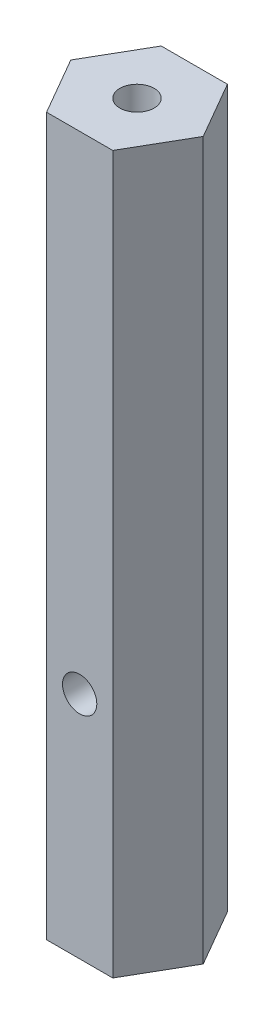
ISO-10303-21;
HEADER;
FILE_DESCRIPTION(('STEP AP214'),'2;1');
FILE_NAME('part.step','',(''),(''),'','','');
FILE_SCHEMA(('AUTOMOTIVE_DESIGN { 1 0 10303 214 1 1 1 1 }'));
ENDSEC;
DATA;
#1=APPLICATION_CONTEXT('core data for automotive mechanical design processes');
#2=APPLICATION_PROTOCOL_DEFINITION('international standard','automotive_design',2000,#1);
#3=PRODUCT_CONTEXT('',#1,'mechanical');
#4=PRODUCT('Part','Part','',(#3));
#5=PRODUCT_RELATED_PRODUCT_CATEGORY('part','',(#4));
#6=PRODUCT_DEFINITION_FORMATION('','',#4);
#7=PRODUCT_DEFINITION_CONTEXT('part definition',#1,'design');
#8=PRODUCT_DEFINITION('design','',#6,#7);
#9=PRODUCT_DEFINITION_SHAPE('','',#8);
#10=(LENGTH_UNIT() NAMED_UNIT(*) SI_UNIT(.MILLI.,.METRE.));
#11=(NAMED_UNIT(*) PLANE_ANGLE_UNIT() SI_UNIT($,.RADIAN.));
#12=(NAMED_UNIT(*) SI_UNIT($,.STERADIAN.) SOLID_ANGLE_UNIT());
#13=UNCERTAINTY_MEASURE_WITH_UNIT(LENGTH_MEASURE(1.E-05),#10,'distance_accuracy_value','');
#14=(GEOMETRIC_REPRESENTATION_CONTEXT(3) GLOBAL_UNCERTAINTY_ASSIGNED_CONTEXT((#13)) GLOBAL_UNIT_ASSIGNED_CONTEXT((#10,
#11,#12)) REPRESENTATION_CONTEXT('',''));
#15=CARTESIAN_POINT('',(0.,0.,0.));
#16=DIRECTION('',(0.,0.,1.));
#17=DIRECTION('',(1.,0.,0.));
#18=AXIS2_PLACEMENT_3D('',#15,#16,#17);
#19=CARTESIAN_POINT('',(3.66617420935419,79.375,6.34999999999994));
#20=DIRECTION('',(-0.866025403784441,0.,-0.499999999999995));
#21=DIRECTION('',(-0.499999999999995,0.,0.866025403784442));
#22=AXIS2_PLACEMENT_3D('',#19,#20,#21);
#23=PLANE('',#22);
#24=DIRECTION('',(0.499999999999995,0.,-0.866025403784442));
#25=VECTOR('',#24,1.);
#26=CARTESIAN_POINT('',(3.66617420935419,0.,6.34999999999994));
#27=LINE('',#26,#25);
#28=CARTESIAN_POINT('',(3.66617420935419,0.,6.34999999999994));
#29=VERTEX_POINT('',#28);
#30=CARTESIAN_POINT('',(7.33234841870822,0.,0.));
#31=VERTEX_POINT('',#30);
#32=EDGE_CURVE('E119',#29,#31,#27,.T.);
#33=ORIENTED_EDGE('',*,*,#32,.T.);
#34=DIRECTION('',(0.,-1.,0.));
#35=VECTOR('',#34,1.);
#36=CARTESIAN_POINT('',(7.33234841870822,79.375,0.));
#37=LINE('',#36,#35);
#38=CARTESIAN_POINT('',(7.33234841870822,79.375,0.));
#39=VERTEX_POINT('',#38);
#40=EDGE_CURVE('E11',#39,#31,#37,.T.);
#41=ORIENTED_EDGE('',*,*,#40,.F.);
#42=DIRECTION('',(0.499999999999995,0.,-0.866025403784442));
#43=VECTOR('',#42,1.);
#44=CARTESIAN_POINT('',(3.66617420935419,79.375,6.34999999999994));
#45=LINE('',#44,#43);
#46=CARTESIAN_POINT('',(3.66617420935419,79.375,6.34999999999994));
#47=VERTEX_POINT('',#46);
#48=EDGE_CURVE('E130',#47,#39,#45,.T.);
#49=ORIENTED_EDGE('',*,*,#48,.F.);
#50=DIRECTION('',(0.,-1.,0.));
#51=VECTOR('',#50,1.);
#52=CARTESIAN_POINT('',(3.66617420935419,79.375,6.34999999999994));
#53=LINE('',#52,#51);
#54=EDGE_CURVE('E115',#47,#29,#53,.T.);
#55=ORIENTED_EDGE('',*,*,#54,.T.);
#56=EDGE_LOOP('',(#33,#41,#49,#55));
#57=FACE_BOUND('',#56,.T.);
#58=ADVANCED_FACE('F33',(#57),#23,.F.);
#59=CARTESIAN_POINT('',(7.33234841870822,79.375,0.));
#60=DIRECTION('',(-0.866025403784438,0.,0.500000000000001));
#61=DIRECTION('',(0.500000000000001,0.,0.866025403784438));
#62=AXIS2_PLACEMENT_3D('',#59,#60,#61);
#63=PLANE('',#62);
#64=DIRECTION('',(-0.500000000000001,0.,-0.866025403784438));
#65=VECTOR('',#64,1.);
#66=CARTESIAN_POINT('',(7.33234841870822,0.,0.));
#67=LINE('',#66,#65);
#68=CARTESIAN_POINT('',(3.6661742093541,0.,-6.34999999999999));
#69=VERTEX_POINT('',#68);
#70=EDGE_CURVE('E122',#31,#69,#67,.T.);
#71=ORIENTED_EDGE('',*,*,#70,.T.);
#72=DIRECTION('',(0.,-1.,0.));
#73=VECTOR('',#72,1.);
#74=CARTESIAN_POINT('',(3.6661742093541,79.375,-6.34999999999999));
#75=LINE('',#74,#73);
#76=CARTESIAN_POINT('',(3.6661742093541,79.375,-6.34999999999999));
#77=VERTEX_POINT('',#76);
#78=EDGE_CURVE('E41',#77,#69,#75,.T.);
#79=ORIENTED_EDGE('',*,*,#78,.F.);
#80=DIRECTION('',(-0.500000000000001,0.,-0.866025403784438));
#81=VECTOR('',#80,1.);
#82=CARTESIAN_POINT('',(7.33234841870822,79.375,0.));
#83=LINE('',#82,#81);
#84=EDGE_CURVE('E87',#39,#77,#83,.T.);
#85=ORIENTED_EDGE('',*,*,#84,.F.);
#86=ORIENTED_EDGE('',*,*,#40,.T.);
#87=EDGE_LOOP('',(#71,#79,#85,#86));
#88=FACE_BOUND('',#87,.T.);
#89=ADVANCED_FACE('F157',(#88),#63,.F.);
#90=CARTESIAN_POINT('',(3.6661742093541,79.375,-6.34999999999999));
#91=DIRECTION('',(0.,0.,1.));
#92=DIRECTION('',(1.,0.,0.));
#93=AXIS2_PLACEMENT_3D('',#90,#91,#92);
#94=PLANE('',#93);
#95=CARTESIAN_POINT('',(0.,25.4,-6.34999999999998));
#96=DIRECTION('',(0.,0.,1.));
#97=DIRECTION('',(1.,0.,0.));
#98=AXIS2_PLACEMENT_3D('',#95,#96,#97);
#99=CIRCLE('',#98,1.89864999999999);
#100=CARTESIAN_POINT('',(1.89865000000005,25.4,-6.34999999999998));
#101=VERTEX_POINT('',#100);
#102=EDGE_CURVE('E237',#101,#101,#99,.T.);
#103=ORIENTED_EDGE('',*,*,#102,.T.);
#104=EDGE_LOOP('',(#103));
#105=FACE_BOUND('',#104,.T.);
#106=DIRECTION('',(-1.,0.,0.));
#107=VECTOR('',#106,1.);
#108=CARTESIAN_POINT('',(3.6661742093541,0.,-6.34999999999999));
#109=LINE('',#108,#107);
#110=CARTESIAN_POINT('',(-3.66617420935414,0.,-6.34999999999996));
#111=VERTEX_POINT('',#110);
#112=EDGE_CURVE('E125',#69,#111,#109,.T.);
#113=ORIENTED_EDGE('',*,*,#112,.T.);
#114=DIRECTION('',(0.,-1.,0.));
#115=VECTOR('',#114,1.);
#116=CARTESIAN_POINT('',(-3.66617420935414,79.375,-6.34999999999996));
#117=LINE('',#116,#115);
#118=CARTESIAN_POINT('',(-3.66617420935414,79.375,-6.34999999999996));
#119=VERTEX_POINT('',#118);
#120=EDGE_CURVE('E110',#119,#111,#117,.T.);
#121=ORIENTED_EDGE('',*,*,#120,.F.);
#122=DIRECTION('',(-1.,0.,0.));
#123=VECTOR('',#122,1.);
#124=CARTESIAN_POINT('',(3.6661742093541,79.375,-6.34999999999999));
#125=LINE('',#124,#123);
#126=EDGE_CURVE('E101',#77,#119,#125,.T.);
#127=ORIENTED_EDGE('',*,*,#126,.F.);
#128=ORIENTED_EDGE('',*,*,#78,.T.);
#129=EDGE_LOOP('',(#113,#121,#127,#128));
#130=FACE_BOUND('',#129,.T.);
#131=ADVANCED_FACE('F136',(#105,#130),#94,.F.);
#132=CARTESIAN_POINT('',(-3.66617420935414,79.375,-6.34999999999996));
#133=DIRECTION('',(0.866025403784441,0.,0.499999999999995));
#134=DIRECTION('',(0.499999999999995,0.,-0.866025403784442));
#135=AXIS2_PLACEMENT_3D('',#132,#133,#134);
#136=PLANE('',#135);
#137=DIRECTION('',(-0.499999999999995,0.,0.866025403784442));
#138=VECTOR('',#137,1.);
#139=CARTESIAN_POINT('',(-3.66617420935414,0.,-6.34999999999996));
#140=LINE('',#139,#138);
#141=CARTESIAN_POINT('',(-7.33234841870822,0.,0.));
#142=VERTEX_POINT('',#141);
#143=EDGE_CURVE('E109',#111,#142,#140,.T.);
#144=ORIENTED_EDGE('',*,*,#143,.T.);
#145=DIRECTION('',(0.,-1.,0.));
#146=VECTOR('',#145,1.);
#147=CARTESIAN_POINT('',(-7.33234841870822,79.375,0.));
#148=LINE('',#147,#146);
#149=CARTESIAN_POINT('',(-7.33234841870822,79.375,0.));
#150=VERTEX_POINT('',#149);
#151=EDGE_CURVE('E106',#150,#142,#148,.T.);
#152=ORIENTED_EDGE('',*,*,#151,.F.);
#153=DIRECTION('',(-0.499999999999995,0.,0.866025403784442));
#154=VECTOR('',#153,1.);
#155=CARTESIAN_POINT('',(-3.66617420935414,79.375,-6.34999999999996));
#156=LINE('',#155,#154);
#157=EDGE_CURVE('E95',#119,#150,#156,.T.);
#158=ORIENTED_EDGE('',*,*,#157,.F.);
#159=ORIENTED_EDGE('',*,*,#120,.T.);
#160=EDGE_LOOP('',(#144,#152,#158,#159));
#161=FACE_BOUND('',#160,.T.);
#162=ADVANCED_FACE('F107',(#161),#136,.F.);
#163=CARTESIAN_POINT('',(-7.33234841870822,79.375,0.));
#164=DIRECTION('',(0.866025403784435,0.,-0.500000000000007));
#165=DIRECTION('',(-0.500000000000007,0.,-0.866025403784435));
#166=AXIS2_PLACEMENT_3D('',#163,#164,#165);
#167=PLANE('',#166);
#168=DIRECTION('',(0.500000000000007,0.,0.866025403784435));
#169=VECTOR('',#168,1.);
#170=CARTESIAN_POINT('',(-7.33234841870822,0.,0.));
#171=LINE('',#170,#169);
#172=CARTESIAN_POINT('',(-3.66617420935405,0.,6.35000000000001));
#173=VERTEX_POINT('',#172);
#174=EDGE_CURVE('E73',#142,#173,#171,.T.);
#175=ORIENTED_EDGE('',*,*,#174,.T.);
#176=DIRECTION('',(0.,-1.,0.));
#177=VECTOR('',#176,1.);
#178=CARTESIAN_POINT('',(-3.66617420935405,79.375,6.35000000000001));
#179=LINE('',#178,#177);
#180=CARTESIAN_POINT('',(-3.66617420935405,79.375,6.35000000000001));
#181=VERTEX_POINT('',#180);
#182=EDGE_CURVE('E111',#181,#173,#179,.T.);
#183=ORIENTED_EDGE('',*,*,#182,.F.);
#184=DIRECTION('',(0.500000000000007,0.,0.866025403784435));
#185=VECTOR('',#184,1.);
#186=CARTESIAN_POINT('',(-7.33234841870822,79.375,0.));
#187=LINE('',#186,#185);
#188=EDGE_CURVE('E99',#150,#181,#187,.T.);
#189=ORIENTED_EDGE('',*,*,#188,.F.);
#190=ORIENTED_EDGE('',*,*,#151,.T.);
#191=EDGE_LOOP('',(#175,#183,#189,#190));
#192=FACE_BOUND('',#191,.T.);
#193=ADVANCED_FACE('F113',(#192),#167,.F.);
#194=CARTESIAN_POINT('',(-3.66617420935405,79.375,6.35000000000001));
#195=DIRECTION('',(0.,0.,-1.));
#196=DIRECTION('',(-1.,0.,0.));
#197=AXIS2_PLACEMENT_3D('',#194,#195,#196);
#198=PLANE('',#197);
#199=CARTESIAN_POINT('',(0.,25.4,6.34999999999998));
#200=DIRECTION('',(0.,0.,1.));
#201=DIRECTION('',(1.,0.,0.));
#202=AXIS2_PLACEMENT_3D('',#199,#200,#201);
#203=CIRCLE('',#202,1.89864999999999);
#204=CARTESIAN_POINT('',(1.89865000000006,25.4,6.34999999999998));
#205=VERTEX_POINT('',#204);
#206=EDGE_CURVE('E234',#205,#205,#203,.T.);
#207=ORIENTED_EDGE('',*,*,#206,.F.);
#208=EDGE_LOOP('',(#207));
#209=FACE_BOUND('',#208,.T.);
#210=DIRECTION('',(1.,0.,0.));
#211=VECTOR('',#210,1.);
#212=CARTESIAN_POINT('',(-3.66617420935405,0.,6.35000000000001));
#213=LINE('',#212,#211);
#214=EDGE_CURVE('E79',#173,#29,#213,.T.);
#215=ORIENTED_EDGE('',*,*,#214,.T.);
#216=ORIENTED_EDGE('',*,*,#54,.F.);
#217=DIRECTION('',(1.,0.,0.));
#218=VECTOR('',#217,1.);
#219=CARTESIAN_POINT('',(-3.66617420935405,79.375,6.35000000000001));
#220=LINE('',#219,#218);
#221=EDGE_CURVE('E49',#181,#47,#220,.T.);
#222=ORIENTED_EDGE('',*,*,#221,.F.);
#223=ORIENTED_EDGE('',*,*,#182,.T.);
#224=EDGE_LOOP('',(#215,#216,#222,#223));
#225=FACE_BOUND('',#224,.T.);
#226=ADVANCED_FACE('F143',(#209,#225),#198,.F.);
#227=CARTESIAN_POINT('',(0.,79.375,0.));
#228=DIRECTION('',(0.,1.,0.));
#229=DIRECTION('',(0.,0.,1.));
#230=AXIS2_PLACEMENT_3D('',#227,#228,#229);
#231=PLANE('',#230);
#232=CARTESIAN_POINT('',(0.,79.375,0.));
#233=DIRECTION('',(0.,1.,0.));
#234=DIRECTION('',(0.,0.,1.));
#235=AXIS2_PLACEMENT_3D('',#232,#233,#234);
#236=CIRCLE('',#235,1.89864999999999);
#237=CARTESIAN_POINT('',(0.,79.375,1.89864999999999));
#238=VERTEX_POINT('',#237);
#239=EDGE_CURVE('E238',#238,#238,#236,.T.);
#240=ORIENTED_EDGE('',*,*,#239,.F.);
#241=EDGE_LOOP('',(#240));
#242=FACE_BOUND('',#241,.T.);
#243=ORIENTED_EDGE('',*,*,#48,.T.);
#244=ORIENTED_EDGE('',*,*,#84,.T.);
#245=ORIENTED_EDGE('',*,*,#126,.T.);
#246=ORIENTED_EDGE('',*,*,#157,.T.);
#247=ORIENTED_EDGE('',*,*,#188,.T.);
#248=ORIENTED_EDGE('',*,*,#221,.T.);
#249=EDGE_LOOP('',(#243,#244,#245,#246,#247,#248));
#250=FACE_BOUND('',#249,.T.);
#251=ADVANCED_FACE('F97',(#242,#250),#231,.T.);
#252=CARTESIAN_POINT('',(0.,0.,0.));
#253=DIRECTION('',(0.,1.,0.));
#254=DIRECTION('',(0.,0.,1.));
#255=AXIS2_PLACEMENT_3D('',#252,#253,#254);
#256=PLANE('',#255);
#257=ORIENTED_EDGE('',*,*,#32,.F.);
#258=ORIENTED_EDGE('',*,*,#214,.F.);
#259=ORIENTED_EDGE('',*,*,#174,.F.);
#260=ORIENTED_EDGE('',*,*,#143,.F.);
#261=ORIENTED_EDGE('',*,*,#112,.F.);
#262=ORIENTED_EDGE('',*,*,#70,.F.);
#263=EDGE_LOOP('',(#257,#258,#259,#260,#261,#262));
#264=FACE_BOUND('',#263,.T.);
#265=ADVANCED_FACE('F139',(#264),#256,.F.);
#266=CARTESIAN_POINT('',(0.,53.975,0.));
#267=DIRECTION('',(0.,1.,0.));
#268=DIRECTION('',(0.,0.,1.));
#269=AXIS2_PLACEMENT_3D('',#266,#267,#268);
#270=CONICAL_SURFACE('',#269,1.89864999999999,1.02974425867665);
#271=CARTESIAN_POINT('',(0.,52.8341759856833,0.));
#272=VERTEX_POINT('',#271);
#273=VERTEX_LOOP('',#272);
#274=FACE_BOUND('',#273,.T.);
#275=CARTESIAN_POINT('',(0.,53.975,0.));
#276=DIRECTION('',(0.,1.,0.));
#277=DIRECTION('',(0.,0.,1.));
#278=AXIS2_PLACEMENT_3D('',#275,#276,#277);
#279=CIRCLE('',#278,1.89864999999999);
#280=CARTESIAN_POINT('',(0.,53.975,1.89864999999999));
#281=VERTEX_POINT('',#280);
#282=EDGE_CURVE('E123',#281,#281,#279,.T.);
#283=ORIENTED_EDGE('',*,*,#282,.T.);
#284=EDGE_LOOP('',(#283));
#285=FACE_BOUND('',#284,.T.);
#286=ADVANCED_FACE('F186',(#274,#285),#270,.F.);
#287=CARTESIAN_POINT('',(0.,79.375,0.));
#288=DIRECTION('',(0.,1.,0.));
#289=DIRECTION('',(0.,0.,1.));
#290=AXIS2_PLACEMENT_3D('',#287,#288,#289);
#291=CYLINDRICAL_SURFACE('',#290,1.89864999999999);
#292=ORIENTED_EDGE('',*,*,#282,.F.);
#293=EDGE_LOOP('',(#292));
#294=FACE_BOUND('',#293,.T.);
#295=ORIENTED_EDGE('',*,*,#239,.T.);
#296=EDGE_LOOP('',(#295));
#297=FACE_BOUND('',#296,.T.);
#298=ADVANCED_FACE('F200',(#294,#297),#291,.F.);
#299=CARTESIAN_POINT('',(0.,25.4,6.34999999999997));
#300=DIRECTION('',(0.,0.,1.));
#301=DIRECTION('',(1.,0.,0.));
#302=AXIS2_PLACEMENT_3D('',#299,#300,#301);
#303=CYLINDRICAL_SURFACE('',#302,1.89864999999999);
#304=ORIENTED_EDGE('',*,*,#206,.T.);
#305=EDGE_LOOP('',(#304));
#306=FACE_BOUND('',#305,.T.);
#307=ORIENTED_EDGE('',*,*,#102,.F.);
#308=EDGE_LOOP('',(#307));
#309=FACE_BOUND('',#308,.T.);
#310=ADVANCED_FACE('F209',(#306,#309),#303,.F.);
#311=CLOSED_SHELL('',(#58,#89,#131,#162,#193,#226,#251,#265,#286,#298,#310));
#312=MANIFOLD_SOLID_BREP('B2',#311);
#313=ADVANCED_BREP_SHAPE_REPRESENTATION('',(#18,#312),#14);
#314=SHAPE_DEFINITION_REPRESENTATION(#9,#313);
ENDSEC;
END-ISO-10303-21;
